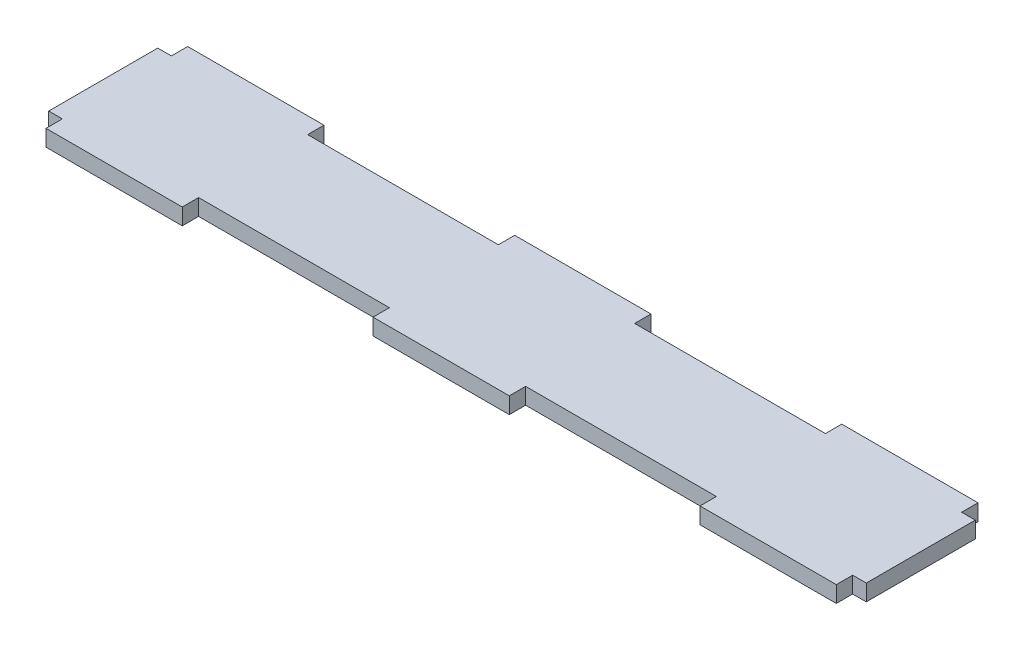
ISO-10303-21;
HEADER;
FILE_DESCRIPTION(('STEP AP214'),'2;1');
FILE_NAME('part.step','',(''),(''),'','','');
FILE_SCHEMA(('AUTOMOTIVE_DESIGN { 1 0 10303 214 1 1 1 1 }'));
ENDSEC;
DATA;
#1=APPLICATION_CONTEXT('core data for automotive mechanical design processes');
#2=APPLICATION_PROTOCOL_DEFINITION('international standard','automotive_design',2000,#1);
#3=PRODUCT_CONTEXT('',#1,'mechanical');
#4=PRODUCT('Part','Part','',(#3));
#5=PRODUCT_RELATED_PRODUCT_CATEGORY('part','',(#4));
#6=PRODUCT_DEFINITION_FORMATION('','',#4);
#7=PRODUCT_DEFINITION_CONTEXT('part definition',#1,'design');
#8=PRODUCT_DEFINITION('design','',#6,#7);
#9=PRODUCT_DEFINITION_SHAPE('','',#8);
#10=(LENGTH_UNIT() NAMED_UNIT(*) SI_UNIT(.MILLI.,.METRE.));
#11=(NAMED_UNIT(*) PLANE_ANGLE_UNIT() SI_UNIT($,.RADIAN.));
#12=(NAMED_UNIT(*) SI_UNIT($,.STERADIAN.) SOLID_ANGLE_UNIT());
#13=UNCERTAINTY_MEASURE_WITH_UNIT(LENGTH_MEASURE(1.E-05),#10,'distance_accuracy_value','');
#14=(GEOMETRIC_REPRESENTATION_CONTEXT(3) GLOBAL_UNCERTAINTY_ASSIGNED_CONTEXT((#13)) GLOBAL_UNIT_ASSIGNED_CONTEXT((#10,
#11,#12)) REPRESENTATION_CONTEXT('',''));
#15=CARTESIAN_POINT('',(0.,0.,0.));
#16=DIRECTION('',(0.,0.,1.));
#17=DIRECTION('',(1.,0.,0.));
#18=AXIS2_PLACEMENT_3D('',#15,#16,#17);
#19=CARTESIAN_POINT('',(75.,3.,0.));
#20=DIRECTION('',(1.,0.,0.));
#21=DIRECTION('',(0.,0.,-1.));
#22=AXIS2_PLACEMENT_3D('',#19,#20,#21);
#23=PLANE('',#22);
#24=DIRECTION('',(0.,0.,1.));
#25=VECTOR('',#24,1.);
#26=CARTESIAN_POINT('',(75.,0.,0.));
#27=LINE('',#26,#25);
#28=CARTESIAN_POINT('',(75.,0.,-10.));
#29=VERTEX_POINT('',#28);
#30=CARTESIAN_POINT('',(75.,0.,10.));
#31=VERTEX_POINT('',#30);
#32=EDGE_CURVE('E256',#29,#31,#27,.T.);
#33=ORIENTED_EDGE('',*,*,#32,.F.);
#34=DIRECTION('',(0.,-1.,0.));
#35=VECTOR('',#34,1.);
#36=CARTESIAN_POINT('',(75.,3.,-10.));
#37=LINE('',#36,#35);
#38=CARTESIAN_POINT('',(75.,3.,-10.));
#39=VERTEX_POINT('',#38);
#40=EDGE_CURVE('E11',#39,#29,#37,.T.);
#41=ORIENTED_EDGE('',*,*,#40,.F.);
#42=DIRECTION('',(0.,0.,1.));
#43=VECTOR('',#42,1.);
#44=CARTESIAN_POINT('',(75.,3.,0.));
#45=LINE('',#44,#43);
#46=CARTESIAN_POINT('',(75.,3.,10.));
#47=VERTEX_POINT('',#46);
#48=EDGE_CURVE('E387',#39,#47,#45,.T.);
#49=ORIENTED_EDGE('',*,*,#48,.T.);
#50=DIRECTION('',(0.,-1.,0.));
#51=VECTOR('',#50,1.);
#52=CARTESIAN_POINT('',(75.,3.,10.));
#53=LINE('',#52,#51);
#54=EDGE_CURVE('E151',#47,#31,#53,.T.);
#55=ORIENTED_EDGE('',*,*,#54,.T.);
#56=EDGE_LOOP('',(#33,#41,#49,#55));
#57=FACE_BOUND('',#56,.T.);
#58=ADVANCED_FACE('F41',(#57),#23,.T.);
#59=CARTESIAN_POINT('',(0.,3.,-10.));
#60=DIRECTION('',(0.,0.,-1.));
#61=DIRECTION('',(-1.,0.,0.));
#62=AXIS2_PLACEMENT_3D('',#59,#60,#61);
#63=PLANE('',#62);
#64=DIRECTION('',(1.,0.,0.));
#65=VECTOR('',#64,1.);
#66=CARTESIAN_POINT('',(0.,0.,-10.));
#67=LINE('',#66,#65);
#68=CARTESIAN_POINT('',(72.5,0.,-10.));
#69=VERTEX_POINT('',#68);
#70=EDGE_CURVE('E259',#69,#29,#67,.T.);
#71=ORIENTED_EDGE('',*,*,#70,.F.);
#72=DIRECTION('',(0.,-1.,0.));
#73=VECTOR('',#72,1.);
#74=CARTESIAN_POINT('',(72.5,3.,-10.));
#75=LINE('',#74,#73);
#76=CARTESIAN_POINT('',(72.5,3.,-10.));
#77=VERTEX_POINT('',#76);
#78=EDGE_CURVE('E49',#77,#69,#75,.T.);
#79=ORIENTED_EDGE('',*,*,#78,.F.);
#80=DIRECTION('',(1.,0.,0.));
#81=VECTOR('',#80,1.);
#82=CARTESIAN_POINT('',(0.,3.,-10.));
#83=LINE('',#82,#81);
#84=EDGE_CURVE('E386',#77,#39,#83,.T.);
#85=ORIENTED_EDGE('',*,*,#84,.T.);
#86=ORIENTED_EDGE('',*,*,#40,.T.);
#87=EDGE_LOOP('',(#71,#79,#85,#86));
#88=FACE_BOUND('',#87,.T.);
#89=ADVANCED_FACE('F385',(#88),#63,.T.);
#90=CARTESIAN_POINT('',(72.5,3.,0.));
#91=DIRECTION('',(-1.,0.,0.));
#92=DIRECTION('',(0.,0.,1.));
#93=AXIS2_PLACEMENT_3D('',#90,#91,#92);
#94=PLANE('',#93);
#95=DIRECTION('',(0.,0.,-1.));
#96=VECTOR('',#95,1.);
#97=CARTESIAN_POINT('',(72.5,0.,0.));
#98=LINE('',#97,#96);
#99=CARTESIAN_POINT('',(72.5,0.,-13.));
#100=VERTEX_POINT('',#99);
#101=EDGE_CURVE('E262',#69,#100,#98,.T.);
#102=ORIENTED_EDGE('',*,*,#101,.T.);
#103=DIRECTION('',(0.,-1.,0.));
#104=VECTOR('',#103,1.);
#105=CARTESIAN_POINT('',(72.5,3.,-13.));
#106=LINE('',#105,#104);
#107=CARTESIAN_POINT('',(72.5,3.,-13.));
#108=VERTEX_POINT('',#107);
#109=EDGE_CURVE('E371',#108,#100,#106,.T.);
#110=ORIENTED_EDGE('',*,*,#109,.F.);
#111=DIRECTION('',(0.,0.,-1.));
#112=VECTOR('',#111,1.);
#113=CARTESIAN_POINT('',(72.5,3.,0.));
#114=LINE('',#113,#112);
#115=EDGE_CURVE('E377',#77,#108,#114,.T.);
#116=ORIENTED_EDGE('',*,*,#115,.F.);
#117=ORIENTED_EDGE('',*,*,#78,.T.);
#118=EDGE_LOOP('',(#102,#110,#116,#117));
#119=FACE_BOUND('',#118,.T.);
#120=ADVANCED_FACE('F375',(#119),#94,.F.);
#121=CARTESIAN_POINT('',(0.,3.,-13.));
#122=DIRECTION('',(0.,0.,-1.));
#123=DIRECTION('',(-1.,0.,0.));
#124=AXIS2_PLACEMENT_3D('',#121,#122,#123);
#125=PLANE('',#124);
#126=DIRECTION('',(1.,0.,0.));
#127=VECTOR('',#126,1.);
#128=CARTESIAN_POINT('',(0.,0.,-13.));
#129=LINE('',#128,#127);
#130=CARTESIAN_POINT('',(47.5,0.,-13.));
#131=VERTEX_POINT('',#130);
#132=EDGE_CURVE('E267',#131,#100,#129,.T.);
#133=ORIENTED_EDGE('',*,*,#132,.F.);
#134=DIRECTION('',(0.,-1.,0.));
#135=VECTOR('',#134,1.);
#136=CARTESIAN_POINT('',(47.5,3.,-13.));
#137=LINE('',#136,#135);
#138=CARTESIAN_POINT('',(47.5,3.,-13.));
#139=VERTEX_POINT('',#138);
#140=EDGE_CURVE('E369',#139,#131,#137,.T.);
#141=ORIENTED_EDGE('',*,*,#140,.F.);
#142=DIRECTION('',(1.,0.,0.));
#143=VECTOR('',#142,1.);
#144=CARTESIAN_POINT('',(0.,3.,-13.));
#145=LINE('',#144,#143);
#146=EDGE_CURVE('E457',#139,#108,#145,.T.);
#147=ORIENTED_EDGE('',*,*,#146,.T.);
#148=ORIENTED_EDGE('',*,*,#109,.T.);
#149=EDGE_LOOP('',(#133,#141,#147,#148));
#150=FACE_BOUND('',#149,.T.);
#151=ADVANCED_FACE('F513',(#150),#125,.T.);
#152=CARTESIAN_POINT('',(47.5,3.,0.));
#153=DIRECTION('',(-1.,0.,0.));
#154=DIRECTION('',(0.,0.,1.));
#155=AXIS2_PLACEMENT_3D('',#152,#153,#154);
#156=PLANE('',#155);
#157=DIRECTION('',(0.,0.,-1.));
#158=VECTOR('',#157,1.);
#159=CARTESIAN_POINT('',(47.5,0.,0.));
#160=LINE('',#159,#158);
#161=CARTESIAN_POINT('',(47.5,0.,-10.));
#162=VERTEX_POINT('',#161);
#163=EDGE_CURVE('E270',#162,#131,#160,.T.);
#164=ORIENTED_EDGE('',*,*,#163,.F.);
#165=DIRECTION('',(0.,-1.,0.));
#166=VECTOR('',#165,1.);
#167=CARTESIAN_POINT('',(47.5,3.,-10.));
#168=LINE('',#167,#166);
#169=CARTESIAN_POINT('',(47.5,3.,-10.));
#170=VERTEX_POINT('',#169);
#171=EDGE_CURVE('E367',#170,#162,#168,.T.);
#172=ORIENTED_EDGE('',*,*,#171,.F.);
#173=DIRECTION('',(0.,0.,-1.));
#174=VECTOR('',#173,1.);
#175=CARTESIAN_POINT('',(47.5,3.,0.));
#176=LINE('',#175,#174);
#177=EDGE_CURVE('E454',#170,#139,#176,.T.);
#178=ORIENTED_EDGE('',*,*,#177,.T.);
#179=ORIENTED_EDGE('',*,*,#140,.T.);
#180=EDGE_LOOP('',(#164,#172,#178,#179));
#181=FACE_BOUND('',#180,.T.);
#182=ADVANCED_FACE('F518',(#181),#156,.T.);
#183=CARTESIAN_POINT('',(12.5,0.,-10.));
#184=VERTEX_POINT('',#183);
#185=EDGE_CURVE('E264',#184,#162,#67,.T.);
#186=ORIENTED_EDGE('',*,*,#185,.F.);
#187=DIRECTION('',(0.,-1.,0.));
#188=VECTOR('',#187,1.);
#189=CARTESIAN_POINT('',(12.5,3.,-10.));
#190=LINE('',#189,#188);
#191=CARTESIAN_POINT('',(12.5,3.,-10.));
#192=VERTEX_POINT('',#191);
#193=EDGE_CURVE('E365',#192,#184,#190,.T.);
#194=ORIENTED_EDGE('',*,*,#193,.F.);
#195=EDGE_CURVE('E453',#192,#170,#83,.T.);
#196=ORIENTED_EDGE('',*,*,#195,.T.);
#197=ORIENTED_EDGE('',*,*,#171,.T.);
#198=EDGE_LOOP('',(#186,#194,#196,#197));
#199=FACE_BOUND('',#198,.T.);
#200=ADVANCED_FACE('F504',(#199),#63,.T.);
#201=CARTESIAN_POINT('',(12.5,3.,0.));
#202=DIRECTION('',(-1.,0.,0.));
#203=DIRECTION('',(0.,0.,1.));
#204=AXIS2_PLACEMENT_3D('',#201,#202,#203);
#205=PLANE('',#204);
#206=DIRECTION('',(0.,0.,-1.));
#207=VECTOR('',#206,1.);
#208=CARTESIAN_POINT('',(12.5,0.,0.));
#209=LINE('',#208,#207);
#210=CARTESIAN_POINT('',(12.5,0.,-13.));
#211=VERTEX_POINT('',#210);
#212=EDGE_CURVE('E273',#184,#211,#209,.T.);
#213=ORIENTED_EDGE('',*,*,#212,.T.);
#214=DIRECTION('',(0.,-1.,0.));
#215=VECTOR('',#214,1.);
#216=CARTESIAN_POINT('',(12.5,3.,-13.));
#217=LINE('',#216,#215);
#218=CARTESIAN_POINT('',(12.5,3.,-13.));
#219=VERTEX_POINT('',#218);
#220=EDGE_CURVE('E363',#219,#211,#217,.T.);
#221=ORIENTED_EDGE('',*,*,#220,.F.);
#222=DIRECTION('',(0.,0.,-1.));
#223=VECTOR('',#222,1.);
#224=CARTESIAN_POINT('',(12.5,3.,0.));
#225=LINE('',#224,#223);
#226=EDGE_CURVE('E451',#192,#219,#225,.T.);
#227=ORIENTED_EDGE('',*,*,#226,.F.);
#228=ORIENTED_EDGE('',*,*,#193,.T.);
#229=EDGE_LOOP('',(#213,#221,#227,#228));
#230=FACE_BOUND('',#229,.T.);
#231=ADVANCED_FACE('F517',(#230),#205,.F.);
#232=CARTESIAN_POINT('',(0.,3.,-13.));
#233=DIRECTION('',(0.,0.,-1.));
#234=DIRECTION('',(-1.,0.,0.));
#235=AXIS2_PLACEMENT_3D('',#232,#233,#234);
#236=PLANE('',#235);
#237=DIRECTION('',(1.,0.,0.));
#238=VECTOR('',#237,1.);
#239=CARTESIAN_POINT('',(0.,0.,-13.));
#240=LINE('',#239,#238);
#241=CARTESIAN_POINT('',(-12.5,0.,-13.));
#242=VERTEX_POINT('',#241);
#243=EDGE_CURVE('E276',#242,#211,#240,.T.);
#244=ORIENTED_EDGE('',*,*,#243,.F.);
#245=DIRECTION('',(0.,-1.,0.));
#246=VECTOR('',#245,1.);
#247=CARTESIAN_POINT('',(-12.5,3.,-13.));
#248=LINE('',#247,#246);
#249=CARTESIAN_POINT('',(-12.5,3.,-13.));
#250=VERTEX_POINT('',#249);
#251=EDGE_CURVE('E361',#250,#242,#248,.T.);
#252=ORIENTED_EDGE('',*,*,#251,.F.);
#253=DIRECTION('',(1.,0.,0.));
#254=VECTOR('',#253,1.);
#255=CARTESIAN_POINT('',(0.,3.,-13.));
#256=LINE('',#255,#254);
#257=EDGE_CURVE('E448',#250,#219,#256,.T.);
#258=ORIENTED_EDGE('',*,*,#257,.T.);
#259=ORIENTED_EDGE('',*,*,#220,.T.);
#260=EDGE_LOOP('',(#244,#252,#258,#259));
#261=FACE_BOUND('',#260,.T.);
#262=ADVANCED_FACE('F555',(#261),#236,.T.);
#263=CARTESIAN_POINT('',(-12.5,3.,0.));
#264=DIRECTION('',(-1.,0.,0.));
#265=DIRECTION('',(0.,0.,1.));
#266=AXIS2_PLACEMENT_3D('',#263,#264,#265);
#267=PLANE('',#266);
#268=DIRECTION('',(0.,0.,-1.));
#269=VECTOR('',#268,1.);
#270=CARTESIAN_POINT('',(-12.5,0.,0.));
#271=LINE('',#270,#269);
#272=CARTESIAN_POINT('',(-12.5,0.,-10.));
#273=VERTEX_POINT('',#272);
#274=EDGE_CURVE('E279',#273,#242,#271,.T.);
#275=ORIENTED_EDGE('',*,*,#274,.F.);
#276=DIRECTION('',(0.,-1.,0.));
#277=VECTOR('',#276,1.);
#278=CARTESIAN_POINT('',(-12.5,3.,-10.));
#279=LINE('',#278,#277);
#280=CARTESIAN_POINT('',(-12.5,3.,-10.));
#281=VERTEX_POINT('',#280);
#282=EDGE_CURVE('E359',#281,#273,#279,.T.);
#283=ORIENTED_EDGE('',*,*,#282,.F.);
#284=DIRECTION('',(0.,0.,-1.));
#285=VECTOR('',#284,1.);
#286=CARTESIAN_POINT('',(-12.5,3.,0.));
#287=LINE('',#286,#285);
#288=EDGE_CURVE('E445',#281,#250,#287,.T.);
#289=ORIENTED_EDGE('',*,*,#288,.T.);
#290=ORIENTED_EDGE('',*,*,#251,.T.);
#291=EDGE_LOOP('',(#275,#283,#289,#290));
#292=FACE_BOUND('',#291,.T.);
#293=ADVANCED_FACE('F474',(#292),#267,.T.);
#294=CARTESIAN_POINT('',(-47.5,0.,-10.));
#295=VERTEX_POINT('',#294);
#296=EDGE_CURVE('E282',#295,#273,#67,.T.);
#297=ORIENTED_EDGE('',*,*,#296,.F.);
#298=DIRECTION('',(0.,-1.,0.));
#299=VECTOR('',#298,1.);
#300=CARTESIAN_POINT('',(-47.5,3.,-10.));
#301=LINE('',#300,#299);
#302=CARTESIAN_POINT('',(-47.5,3.,-10.));
#303=VERTEX_POINT('',#302);
#304=EDGE_CURVE('E357',#303,#295,#301,.T.);
#305=ORIENTED_EDGE('',*,*,#304,.F.);
#306=EDGE_CURVE('E437',#303,#281,#83,.T.);
#307=ORIENTED_EDGE('',*,*,#306,.T.);
#308=ORIENTED_EDGE('',*,*,#282,.T.);
#309=EDGE_LOOP('',(#297,#305,#307,#308));
#310=FACE_BOUND('',#309,.T.);
#311=ADVANCED_FACE('F467',(#310),#63,.T.);
#312=CARTESIAN_POINT('',(-47.5,3.,0.));
#313=DIRECTION('',(-1.,0.,0.));
#314=DIRECTION('',(0.,0.,1.));
#315=AXIS2_PLACEMENT_3D('',#312,#313,#314);
#316=PLANE('',#315);
#317=DIRECTION('',(0.,0.,-1.));
#318=VECTOR('',#317,1.);
#319=CARTESIAN_POINT('',(-47.5,0.,0.));
#320=LINE('',#319,#318);
#321=CARTESIAN_POINT('',(-47.5,0.,-13.));
#322=VERTEX_POINT('',#321);
#323=EDGE_CURVE('E283',#295,#322,#320,.T.);
#324=ORIENTED_EDGE('',*,*,#323,.T.);
#325=DIRECTION('',(0.,-1.,0.));
#326=VECTOR('',#325,1.);
#327=CARTESIAN_POINT('',(-47.5,3.,-13.));
#328=LINE('',#327,#326);
#329=CARTESIAN_POINT('',(-47.5,3.,-13.));
#330=VERTEX_POINT('',#329);
#331=EDGE_CURVE('E354',#330,#322,#328,.T.);
#332=ORIENTED_EDGE('',*,*,#331,.F.);
#333=DIRECTION('',(0.,0.,-1.));
#334=VECTOR('',#333,1.);
#335=CARTESIAN_POINT('',(-47.5,3.,0.));
#336=LINE('',#335,#334);
#337=EDGE_CURVE('E443',#303,#330,#336,.T.);
#338=ORIENTED_EDGE('',*,*,#337,.F.);
#339=ORIENTED_EDGE('',*,*,#304,.T.);
#340=EDGE_LOOP('',(#324,#332,#338,#339));
#341=FACE_BOUND('',#340,.T.);
#342=ADVANCED_FACE('F495',(#341),#316,.F.);
#343=CARTESIAN_POINT('',(0.,3.,-13.));
#344=DIRECTION('',(0.,0.,1.));
#345=DIRECTION('',(1.,0.,0.));
#346=AXIS2_PLACEMENT_3D('',#343,#344,#345);
#347=PLANE('',#346);
#348=DIRECTION('',(-1.,0.,0.));
#349=VECTOR('',#348,1.);
#350=CARTESIAN_POINT('',(0.,0.,-13.));
#351=LINE('',#350,#349);
#352=CARTESIAN_POINT('',(-72.5,0.,-13.));
#353=VERTEX_POINT('',#352);
#354=EDGE_CURVE('E285',#322,#353,#351,.T.);
#355=ORIENTED_EDGE('',*,*,#354,.T.);
#356=DIRECTION('',(0.,-1.,0.));
#357=VECTOR('',#356,1.);
#358=CARTESIAN_POINT('',(-72.5,3.,-13.));
#359=LINE('',#358,#357);
#360=CARTESIAN_POINT('',(-72.5,3.,-13.));
#361=VERTEX_POINT('',#360);
#362=EDGE_CURVE('E352',#361,#353,#359,.T.);
#363=ORIENTED_EDGE('',*,*,#362,.F.);
#364=DIRECTION('',(-1.,0.,0.));
#365=VECTOR('',#364,1.);
#366=CARTESIAN_POINT('',(0.,3.,-13.));
#367=LINE('',#366,#365);
#368=EDGE_CURVE('E441',#330,#361,#367,.T.);
#369=ORIENTED_EDGE('',*,*,#368,.F.);
#370=ORIENTED_EDGE('',*,*,#331,.T.);
#371=EDGE_LOOP('',(#355,#363,#369,#370));
#372=FACE_BOUND('',#371,.T.);
#373=ADVANCED_FACE('F493',(#372),#347,.F.);
#374=CARTESIAN_POINT('',(-72.5,3.,0.));
#375=DIRECTION('',(-1.,0.,0.));
#376=DIRECTION('',(0.,0.,1.));
#377=AXIS2_PLACEMENT_3D('',#374,#375,#376);
#378=PLANE('',#377);
#379=DIRECTION('',(0.,0.,-1.));
#380=VECTOR('',#379,1.);
#381=CARTESIAN_POINT('',(-72.5,0.,0.));
#382=LINE('',#381,#380);
#383=CARTESIAN_POINT('',(-72.5,0.,-10.));
#384=VERTEX_POINT('',#383);
#385=EDGE_CURVE('E288',#384,#353,#382,.T.);
#386=ORIENTED_EDGE('',*,*,#385,.F.);
#387=DIRECTION('',(0.,-1.,0.));
#388=VECTOR('',#387,1.);
#389=CARTESIAN_POINT('',(-72.5,3.,-10.));
#390=LINE('',#389,#388);
#391=CARTESIAN_POINT('',(-72.5,3.,-10.));
#392=VERTEX_POINT('',#391);
#393=EDGE_CURVE('E350',#392,#384,#390,.T.);
#394=ORIENTED_EDGE('',*,*,#393,.F.);
#395=DIRECTION('',(0.,0.,-1.));
#396=VECTOR('',#395,1.);
#397=CARTESIAN_POINT('',(-72.5,3.,0.));
#398=LINE('',#397,#396);
#399=EDGE_CURVE('E435',#392,#361,#398,.T.);
#400=ORIENTED_EDGE('',*,*,#399,.T.);
#401=ORIENTED_EDGE('',*,*,#362,.T.);
#402=EDGE_LOOP('',(#386,#394,#400,#401));
#403=FACE_BOUND('',#402,.T.);
#404=ADVANCED_FACE('F489',(#403),#378,.T.);
#405=CARTESIAN_POINT('',(-75.,0.,-10.));
#406=VERTEX_POINT('',#405);
#407=EDGE_CURVE('E263',#406,#384,#67,.T.);
#408=ORIENTED_EDGE('',*,*,#407,.F.);
#409=DIRECTION('',(0.,-1.,0.));
#410=VECTOR('',#409,1.);
#411=CARTESIAN_POINT('',(-75.,3.,-10.));
#412=LINE('',#411,#410);
#413=CARTESIAN_POINT('',(-75.,3.,-10.));
#414=VERTEX_POINT('',#413);
#415=EDGE_CURVE('E348',#414,#406,#412,.T.);
#416=ORIENTED_EDGE('',*,*,#415,.F.);
#417=EDGE_CURVE('E430',#414,#392,#83,.T.);
#418=ORIENTED_EDGE('',*,*,#417,.T.);
#419=ORIENTED_EDGE('',*,*,#393,.T.);
#420=EDGE_LOOP('',(#408,#416,#418,#419));
#421=FACE_BOUND('',#420,.T.);
#422=ADVANCED_FACE('F486',(#421),#63,.T.);
#423=CARTESIAN_POINT('',(-75.,3.,0.));
#424=DIRECTION('',(1.,0.,0.));
#425=DIRECTION('',(0.,0.,-1.));
#426=AXIS2_PLACEMENT_3D('',#423,#424,#425);
#427=PLANE('',#426);
#428=DIRECTION('',(0.,0.,1.));
#429=VECTOR('',#428,1.);
#430=CARTESIAN_POINT('',(-75.,0.,0.));
#431=LINE('',#430,#429);
#432=CARTESIAN_POINT('',(-75.,0.,10.));
#433=VERTEX_POINT('',#432);
#434=EDGE_CURVE('E291',#406,#433,#431,.T.);
#435=ORIENTED_EDGE('',*,*,#434,.T.);
#436=DIRECTION('',(0.,-1.,0.));
#437=VECTOR('',#436,1.);
#438=CARTESIAN_POINT('',(-75.,3.,10.));
#439=LINE('',#438,#437);
#440=CARTESIAN_POINT('',(-75.,3.,10.));
#441=VERTEX_POINT('',#440);
#442=EDGE_CURVE('E345',#441,#433,#439,.T.);
#443=ORIENTED_EDGE('',*,*,#442,.F.);
#444=DIRECTION('',(0.,0.,1.));
#445=VECTOR('',#444,1.);
#446=CARTESIAN_POINT('',(-75.,3.,0.));
#447=LINE('',#446,#445);
#448=EDGE_CURVE('E427',#414,#441,#447,.T.);
#449=ORIENTED_EDGE('',*,*,#448,.F.);
#450=ORIENTED_EDGE('',*,*,#415,.T.);
#451=EDGE_LOOP('',(#435,#443,#449,#450));
#452=FACE_BOUND('',#451,.T.);
#453=ADVANCED_FACE('F520',(#452),#427,.F.);
#454=CARTESIAN_POINT('',(0.,3.,10.));
#455=DIRECTION('',(0.,0.,-1.));
#456=DIRECTION('',(-1.,0.,0.));
#457=AXIS2_PLACEMENT_3D('',#454,#455,#456);
#458=PLANE('',#457);
#459=DIRECTION('',(1.,0.,0.));
#460=VECTOR('',#459,1.);
#461=CARTESIAN_POINT('',(0.,0.,10.));
#462=LINE('',#461,#460);
#463=CARTESIAN_POINT('',(-72.5,0.,10.));
#464=VERTEX_POINT('',#463);
#465=EDGE_CURVE('E293',#433,#464,#462,.T.);
#466=ORIENTED_EDGE('',*,*,#465,.T.);
#467=DIRECTION('',(0.,-1.,0.));
#468=VECTOR('',#467,1.);
#469=CARTESIAN_POINT('',(-72.5,3.,10.));
#470=LINE('',#469,#468);
#471=CARTESIAN_POINT('',(-72.5,3.,10.));
#472=VERTEX_POINT('',#471);
#473=EDGE_CURVE('E342',#472,#464,#470,.T.);
#474=ORIENTED_EDGE('',*,*,#473,.F.);
#475=DIRECTION('',(1.,0.,0.));
#476=VECTOR('',#475,1.);
#477=CARTESIAN_POINT('',(0.,3.,10.));
#478=LINE('',#477,#476);
#479=EDGE_CURVE('E253',#441,#472,#478,.T.);
#480=ORIENTED_EDGE('',*,*,#479,.F.);
#481=ORIENTED_EDGE('',*,*,#442,.T.);
#482=EDGE_LOOP('',(#466,#474,#480,#481));
#483=FACE_BOUND('',#482,.T.);
#484=ADVANCED_FACE('F525',(#483),#458,.F.);
#485=CARTESIAN_POINT('',(-72.5,3.,0.));
#486=DIRECTION('',(1.,0.,0.));
#487=DIRECTION('',(0.,0.,-1.));
#488=AXIS2_PLACEMENT_3D('',#485,#486,#487);
#489=PLANE('',#488);
#490=DIRECTION('',(0.,0.,1.));
#491=VECTOR('',#490,1.);
#492=CARTESIAN_POINT('',(-72.5,0.,0.));
#493=LINE('',#492,#491);
#494=CARTESIAN_POINT('',(-72.5,0.,13.));
#495=VERTEX_POINT('',#494);
#496=EDGE_CURVE('E295',#464,#495,#493,.T.);
#497=ORIENTED_EDGE('',*,*,#496,.T.);
#498=DIRECTION('',(0.,-1.,0.));
#499=VECTOR('',#498,1.);
#500=CARTESIAN_POINT('',(-72.5,3.,13.));
#501=LINE('',#500,#499);
#502=CARTESIAN_POINT('',(-72.5,3.,13.));
#503=VERTEX_POINT('',#502);
#504=EDGE_CURVE('E340',#503,#495,#501,.T.);
#505=ORIENTED_EDGE('',*,*,#504,.F.);
#506=DIRECTION('',(0.,0.,1.));
#507=VECTOR('',#506,1.);
#508=CARTESIAN_POINT('',(-72.5,3.,0.));
#509=LINE('',#508,#507);
#510=EDGE_CURVE('E426',#472,#503,#509,.T.);
#511=ORIENTED_EDGE('',*,*,#510,.F.);
#512=ORIENTED_EDGE('',*,*,#473,.T.);
#513=EDGE_LOOP('',(#497,#505,#511,#512));
#514=FACE_BOUND('',#513,.T.);
#515=ADVANCED_FACE('F676',(#514),#489,.F.);
#516=CARTESIAN_POINT('',(0.,3.,13.));
#517=DIRECTION('',(0.,0.,1.));
#518=DIRECTION('',(1.,0.,0.));
#519=AXIS2_PLACEMENT_3D('',#516,#517,#518);
#520=PLANE('',#519);
#521=DIRECTION('',(-1.,0.,0.));
#522=VECTOR('',#521,1.);
#523=CARTESIAN_POINT('',(0.,0.,13.));
#524=LINE('',#523,#522);
#525=CARTESIAN_POINT('',(-47.5,0.,13.));
#526=VERTEX_POINT('',#525);
#527=EDGE_CURVE('E300',#526,#495,#524,.T.);
#528=ORIENTED_EDGE('',*,*,#527,.F.);
#529=DIRECTION('',(0.,-1.,0.));
#530=VECTOR('',#529,1.);
#531=CARTESIAN_POINT('',(-47.5,3.,13.));
#532=LINE('',#531,#530);
#533=CARTESIAN_POINT('',(-47.5,3.,13.));
#534=VERTEX_POINT('',#533);
#535=EDGE_CURVE('E338',#534,#526,#532,.T.);
#536=ORIENTED_EDGE('',*,*,#535,.F.);
#537=DIRECTION('',(-1.,0.,0.));
#538=VECTOR('',#537,1.);
#539=CARTESIAN_POINT('',(0.,3.,13.));
#540=LINE('',#539,#538);
#541=EDGE_CURVE('E425',#534,#503,#540,.T.);
#542=ORIENTED_EDGE('',*,*,#541,.T.);
#543=ORIENTED_EDGE('',*,*,#504,.T.);
#544=EDGE_LOOP('',(#528,#536,#542,#543));
#545=FACE_BOUND('',#544,.T.);
#546=ADVANCED_FACE('F687',(#545),#520,.T.);
#547=CARTESIAN_POINT('',(-47.5,3.,0.));
#548=DIRECTION('',(1.,0.,0.));
#549=DIRECTION('',(0.,0.,-1.));
#550=AXIS2_PLACEMENT_3D('',#547,#548,#549);
#551=PLANE('',#550);
#552=DIRECTION('',(0.,0.,1.));
#553=VECTOR('',#552,1.);
#554=CARTESIAN_POINT('',(-47.5,0.,0.));
#555=LINE('',#554,#553);
#556=CARTESIAN_POINT('',(-47.5,0.,10.));
#557=VERTEX_POINT('',#556);
#558=EDGE_CURVE('E303',#557,#526,#555,.T.);
#559=ORIENTED_EDGE('',*,*,#558,.F.);
#560=DIRECTION('',(0.,-1.,0.));
#561=VECTOR('',#560,1.);
#562=CARTESIAN_POINT('',(-47.5,3.,10.));
#563=LINE('',#562,#561);
#564=CARTESIAN_POINT('',(-47.5,3.,10.));
#565=VERTEX_POINT('',#564);
#566=EDGE_CURVE('E336',#565,#557,#563,.T.);
#567=ORIENTED_EDGE('',*,*,#566,.F.);
#568=DIRECTION('',(0.,0.,1.));
#569=VECTOR('',#568,1.);
#570=CARTESIAN_POINT('',(-47.5,3.,0.));
#571=LINE('',#570,#569);
#572=EDGE_CURVE('E422',#565,#534,#571,.T.);
#573=ORIENTED_EDGE('',*,*,#572,.T.);
#574=ORIENTED_EDGE('',*,*,#535,.T.);
#575=EDGE_LOOP('',(#559,#567,#573,#574));
#576=FACE_BOUND('',#575,.T.);
#577=ADVANCED_FACE('F698',(#576),#551,.T.);
#578=CARTESIAN_POINT('',(-12.5,0.,10.));
#579=VERTEX_POINT('',#578);
#580=EDGE_CURVE('E297',#557,#579,#462,.T.);
#581=ORIENTED_EDGE('',*,*,#580,.T.);
#582=DIRECTION('',(0.,-1.,0.));
#583=VECTOR('',#582,1.);
#584=CARTESIAN_POINT('',(-12.5,3.,10.));
#585=LINE('',#584,#583);
#586=CARTESIAN_POINT('',(-12.5,3.,10.));
#587=VERTEX_POINT('',#586);
#588=EDGE_CURVE('E333',#587,#579,#585,.T.);
#589=ORIENTED_EDGE('',*,*,#588,.F.);
#590=EDGE_CURVE('E416',#565,#587,#478,.T.);
#591=ORIENTED_EDGE('',*,*,#590,.F.);
#592=ORIENTED_EDGE('',*,*,#566,.T.);
#593=EDGE_LOOP('',(#581,#589,#591,#592));
#594=FACE_BOUND('',#593,.T.);
#595=ADVANCED_FACE('F395',(#594),#458,.F.);
#596=CARTESIAN_POINT('',(-12.5,3.,0.));
#597=DIRECTION('',(1.,0.,0.));
#598=DIRECTION('',(0.,0.,-1.));
#599=AXIS2_PLACEMENT_3D('',#596,#597,#598);
#600=PLANE('',#599);
#601=DIRECTION('',(0.,0.,1.));
#602=VECTOR('',#601,1.);
#603=CARTESIAN_POINT('',(-12.5,0.,0.));
#604=LINE('',#603,#602);
#605=CARTESIAN_POINT('',(-12.5,0.,13.));
#606=VERTEX_POINT('',#605);
#607=EDGE_CURVE('E306',#579,#606,#604,.T.);
#608=ORIENTED_EDGE('',*,*,#607,.T.);
#609=DIRECTION('',(0.,-1.,0.));
#610=VECTOR('',#609,1.);
#611=CARTESIAN_POINT('',(-12.5,3.,13.));
#612=LINE('',#611,#610);
#613=CARTESIAN_POINT('',(-12.5,3.,13.));
#614=VERTEX_POINT('',#613);
#615=EDGE_CURVE('E330',#614,#606,#612,.T.);
#616=ORIENTED_EDGE('',*,*,#615,.F.);
#617=DIRECTION('',(0.,0.,1.));
#618=VECTOR('',#617,1.);
#619=CARTESIAN_POINT('',(-12.5,3.,0.));
#620=LINE('',#619,#618);
#621=EDGE_CURVE('E403',#587,#614,#620,.T.);
#622=ORIENTED_EDGE('',*,*,#621,.F.);
#623=ORIENTED_EDGE('',*,*,#588,.T.);
#624=EDGE_LOOP('',(#608,#616,#622,#623));
#625=FACE_BOUND('',#624,.T.);
#626=ADVANCED_FACE('F401',(#625),#600,.F.);
#627=CARTESIAN_POINT('',(0.,3.,13.));
#628=DIRECTION('',(0.,0.,-1.));
#629=DIRECTION('',(-1.,0.,0.));
#630=AXIS2_PLACEMENT_3D('',#627,#628,#629);
#631=PLANE('',#630);
#632=DIRECTION('',(1.,0.,0.));
#633=VECTOR('',#632,1.);
#634=CARTESIAN_POINT('',(0.,0.,13.));
#635=LINE('',#634,#633);
#636=CARTESIAN_POINT('',(12.5,0.,13.));
#637=VERTEX_POINT('',#636);
#638=EDGE_CURVE('E308',#606,#637,#635,.T.);
#639=ORIENTED_EDGE('',*,*,#638,.T.);
#640=DIRECTION('',(0.,-1.,0.));
#641=VECTOR('',#640,1.);
#642=CARTESIAN_POINT('',(12.5,3.,13.));
#643=LINE('',#642,#641);
#644=CARTESIAN_POINT('',(12.5,3.,13.));
#645=VERTEX_POINT('',#644);
#646=EDGE_CURVE('E328',#645,#637,#643,.T.);
#647=ORIENTED_EDGE('',*,*,#646,.F.);
#648=DIRECTION('',(1.,0.,0.));
#649=VECTOR('',#648,1.);
#650=CARTESIAN_POINT('',(0.,3.,13.));
#651=LINE('',#650,#649);
#652=EDGE_CURVE('E411',#614,#645,#651,.T.);
#653=ORIENTED_EDGE('',*,*,#652,.F.);
#654=ORIENTED_EDGE('',*,*,#615,.T.);
#655=EDGE_LOOP('',(#639,#647,#653,#654));
#656=FACE_BOUND('',#655,.T.);
#657=ADVANCED_FACE('F408',(#656),#631,.F.);
#658=CARTESIAN_POINT('',(12.5,3.,0.));
#659=DIRECTION('',(1.,0.,0.));
#660=DIRECTION('',(0.,0.,-1.));
#661=AXIS2_PLACEMENT_3D('',#658,#659,#660);
#662=PLANE('',#661);
#663=DIRECTION('',(0.,0.,1.));
#664=VECTOR('',#663,1.);
#665=CARTESIAN_POINT('',(12.5,0.,0.));
#666=LINE('',#665,#664);
#667=CARTESIAN_POINT('',(12.5,0.,10.));
#668=VERTEX_POINT('',#667);
#669=EDGE_CURVE('E311',#668,#637,#666,.T.);
#670=ORIENTED_EDGE('',*,*,#669,.F.);
#671=DIRECTION('',(0.,-1.,0.));
#672=VECTOR('',#671,1.);
#673=CARTESIAN_POINT('',(12.5,3.,10.));
#674=LINE('',#673,#672);
#675=CARTESIAN_POINT('',(12.5,3.,10.));
#676=VERTEX_POINT('',#675);
#677=EDGE_CURVE('E326',#676,#668,#674,.T.);
#678=ORIENTED_EDGE('',*,*,#677,.F.);
#679=DIRECTION('',(0.,0.,1.));
#680=VECTOR('',#679,1.);
#681=CARTESIAN_POINT('',(12.5,3.,0.));
#682=LINE('',#681,#680);
#683=EDGE_CURVE('E413',#676,#645,#682,.T.);
#684=ORIENTED_EDGE('',*,*,#683,.T.);
#685=ORIENTED_EDGE('',*,*,#646,.T.);
#686=EDGE_LOOP('',(#670,#678,#684,#685));
#687=FACE_BOUND('',#686,.T.);
#688=ADVANCED_FACE('F734',(#687),#662,.T.);
#689=CARTESIAN_POINT('',(47.5,0.,10.));
#690=VERTEX_POINT('',#689);
#691=EDGE_CURVE('E314',#668,#690,#462,.T.);
#692=ORIENTED_EDGE('',*,*,#691,.T.);
#693=DIRECTION('',(0.,-1.,0.));
#694=VECTOR('',#693,1.);
#695=CARTESIAN_POINT('',(47.5,3.,10.));
#696=LINE('',#695,#694);
#697=CARTESIAN_POINT('',(47.5,3.,10.));
#698=VERTEX_POINT('',#697);
#699=EDGE_CURVE('E323',#698,#690,#696,.T.);
#700=ORIENTED_EDGE('',*,*,#699,.F.);
#701=EDGE_CURVE('E252',#676,#698,#478,.T.);
#702=ORIENTED_EDGE('',*,*,#701,.F.);
#703=ORIENTED_EDGE('',*,*,#677,.T.);
#704=EDGE_LOOP('',(#692,#700,#702,#703));
#705=FACE_BOUND('',#704,.T.);
#706=ADVANCED_FACE('F717',(#705),#458,.F.);
#707=CARTESIAN_POINT('',(47.5,3.,0.));
#708=DIRECTION('',(1.,0.,0.));
#709=DIRECTION('',(0.,0.,-1.));
#710=AXIS2_PLACEMENT_3D('',#707,#708,#709);
#711=PLANE('',#710);
#712=DIRECTION('',(0.,0.,1.));
#713=VECTOR('',#712,1.);
#714=CARTESIAN_POINT('',(47.5,0.,0.));
#715=LINE('',#714,#713);
#716=CARTESIAN_POINT('',(47.5,0.,13.));
#717=VERTEX_POINT('',#716);
#718=EDGE_CURVE('E315',#690,#717,#715,.T.);
#719=ORIENTED_EDGE('',*,*,#718,.T.);
#720=DIRECTION('',(0.,-1.,0.));
#721=VECTOR('',#720,1.);
#722=CARTESIAN_POINT('',(47.5,3.,13.));
#723=LINE('',#722,#721);
#724=CARTESIAN_POINT('',(47.5,3.,13.));
#725=VERTEX_POINT('',#724);
#726=EDGE_CURVE('E247',#725,#717,#723,.T.);
#727=ORIENTED_EDGE('',*,*,#726,.F.);
#728=DIRECTION('',(0.,0.,1.));
#729=VECTOR('',#728,1.);
#730=CARTESIAN_POINT('',(47.5,3.,0.));
#731=LINE('',#730,#729);
#732=EDGE_CURVE('E234',#698,#725,#731,.T.);
#733=ORIENTED_EDGE('',*,*,#732,.F.);
#734=ORIENTED_EDGE('',*,*,#699,.T.);
#735=EDGE_LOOP('',(#719,#727,#733,#734));
#736=FACE_BOUND('',#735,.T.);
#737=ADVANCED_FACE('F752',(#736),#711,.F.);
#738=CARTESIAN_POINT('',(0.,3.,13.));
#739=DIRECTION('',(0.,0.,-1.));
#740=DIRECTION('',(-1.,0.,0.));
#741=AXIS2_PLACEMENT_3D('',#738,#739,#740);
#742=PLANE('',#741);
#743=DIRECTION('',(1.,0.,0.));
#744=VECTOR('',#743,1.);
#745=CARTESIAN_POINT('',(0.,0.,13.));
#746=LINE('',#745,#744);
#747=CARTESIAN_POINT('',(72.5,0.,13.));
#748=VERTEX_POINT('',#747);
#749=EDGE_CURVE('E243',#717,#748,#746,.T.);
#750=ORIENTED_EDGE('',*,*,#749,.T.);
#751=DIRECTION('',(0.,-1.,0.));
#752=VECTOR('',#751,1.);
#753=CARTESIAN_POINT('',(72.5,3.,13.));
#754=LINE('',#753,#752);
#755=CARTESIAN_POINT('',(72.5,3.,13.));
#756=VERTEX_POINT('',#755);
#757=EDGE_CURVE('E240',#756,#748,#754,.T.);
#758=ORIENTED_EDGE('',*,*,#757,.F.);
#759=DIRECTION('',(1.,0.,0.));
#760=VECTOR('',#759,1.);
#761=CARTESIAN_POINT('',(0.,3.,13.));
#762=LINE('',#761,#760);
#763=EDGE_CURVE('E228',#725,#756,#762,.T.);
#764=ORIENTED_EDGE('',*,*,#763,.F.);
#765=ORIENTED_EDGE('',*,*,#726,.T.);
#766=EDGE_LOOP('',(#750,#758,#764,#765));
#767=FACE_BOUND('',#766,.T.);
#768=ADVANCED_FACE('F241',(#767),#742,.F.);
#769=CARTESIAN_POINT('',(72.5,3.,0.));
#770=DIRECTION('',(1.,0.,0.));
#771=DIRECTION('',(0.,0.,-1.));
#772=AXIS2_PLACEMENT_3D('',#769,#770,#771);
#773=PLANE('',#772);
#774=DIRECTION('',(0.,0.,1.));
#775=VECTOR('',#774,1.);
#776=CARTESIAN_POINT('',(72.5,0.,0.));
#777=LINE('',#776,#775);
#778=CARTESIAN_POINT('',(72.5,0.,10.));
#779=VERTEX_POINT('',#778);
#780=EDGE_CURVE('E318',#779,#748,#777,.T.);
#781=ORIENTED_EDGE('',*,*,#780,.F.);
#782=DIRECTION('',(0.,-1.,0.));
#783=VECTOR('',#782,1.);
#784=CARTESIAN_POINT('',(72.5,3.,10.));
#785=LINE('',#784,#783);
#786=CARTESIAN_POINT('',(72.5,3.,10.));
#787=VERTEX_POINT('',#786);
#788=EDGE_CURVE('E144',#787,#779,#785,.T.);
#789=ORIENTED_EDGE('',*,*,#788,.F.);
#790=DIRECTION('',(0.,0.,1.));
#791=VECTOR('',#790,1.);
#792=CARTESIAN_POINT('',(72.5,3.,0.));
#793=LINE('',#792,#791);
#794=EDGE_CURVE('E232',#787,#756,#793,.T.);
#795=ORIENTED_EDGE('',*,*,#794,.T.);
#796=ORIENTED_EDGE('',*,*,#757,.T.);
#797=EDGE_LOOP('',(#781,#789,#795,#796));
#798=FACE_BOUND('',#797,.T.);
#799=ADVANCED_FACE('F249',(#798),#773,.T.);
#800=EDGE_CURVE('E296',#779,#31,#462,.T.);
#801=ORIENTED_EDGE('',*,*,#800,.T.);
#802=ORIENTED_EDGE('',*,*,#54,.F.);
#803=EDGE_CURVE('E57',#787,#47,#478,.T.);
#804=ORIENTED_EDGE('',*,*,#803,.F.);
#805=ORIENTED_EDGE('',*,*,#788,.T.);
#806=EDGE_LOOP('',(#801,#802,#804,#805));
#807=FACE_BOUND('',#806,.T.);
#808=ADVANCED_FACE('F679',(#807),#458,.F.);
#809=CARTESIAN_POINT('',(0.,3.,0.));
#810=DIRECTION('',(0.,1.,0.));
#811=DIRECTION('',(0.,0.,1.));
#812=AXIS2_PLACEMENT_3D('',#809,#810,#811);
#813=PLANE('',#812);
#814=ORIENTED_EDGE('',*,*,#48,.F.);
#815=ORIENTED_EDGE('',*,*,#84,.F.);
#816=ORIENTED_EDGE('',*,*,#115,.T.);
#817=ORIENTED_EDGE('',*,*,#146,.F.);
#818=ORIENTED_EDGE('',*,*,#177,.F.);
#819=ORIENTED_EDGE('',*,*,#195,.F.);
#820=ORIENTED_EDGE('',*,*,#226,.T.);
#821=ORIENTED_EDGE('',*,*,#257,.F.);
#822=ORIENTED_EDGE('',*,*,#288,.F.);
#823=ORIENTED_EDGE('',*,*,#306,.F.);
#824=ORIENTED_EDGE('',*,*,#337,.T.);
#825=ORIENTED_EDGE('',*,*,#368,.T.);
#826=ORIENTED_EDGE('',*,*,#399,.F.);
#827=ORIENTED_EDGE('',*,*,#417,.F.);
#828=ORIENTED_EDGE('',*,*,#448,.T.);
#829=ORIENTED_EDGE('',*,*,#479,.T.);
#830=ORIENTED_EDGE('',*,*,#510,.T.);
#831=ORIENTED_EDGE('',*,*,#541,.F.);
#832=ORIENTED_EDGE('',*,*,#572,.F.);
#833=ORIENTED_EDGE('',*,*,#590,.T.);
#834=ORIENTED_EDGE('',*,*,#621,.T.);
#835=ORIENTED_EDGE('',*,*,#652,.T.);
#836=ORIENTED_EDGE('',*,*,#683,.F.);
#837=ORIENTED_EDGE('',*,*,#701,.T.);
#838=ORIENTED_EDGE('',*,*,#732,.T.);
#839=ORIENTED_EDGE('',*,*,#763,.T.);
#840=ORIENTED_EDGE('',*,*,#794,.F.);
#841=ORIENTED_EDGE('',*,*,#803,.T.);
#842=EDGE_LOOP('',(#814,#815,#816,#817,#818,#819,#820,#821,#822,#823,#824,#825,#826,#827,#828,
#829,#830,#831,#832,#833,#834,#835,#836,#837,#838,#839,#840,#841));
#843=FACE_BOUND('',#842,.T.);
#844=ADVANCED_FACE('F230',(#843),#813,.T.);
#845=CARTESIAN_POINT('',(0.,0.,0.));
#846=DIRECTION('',(0.,1.,0.));
#847=DIRECTION('',(0.,0.,1.));
#848=AXIS2_PLACEMENT_3D('',#845,#846,#847);
#849=PLANE('',#848);
#850=ORIENTED_EDGE('',*,*,#32,.T.);
#851=ORIENTED_EDGE('',*,*,#800,.F.);
#852=ORIENTED_EDGE('',*,*,#780,.T.);
#853=ORIENTED_EDGE('',*,*,#749,.F.);
#854=ORIENTED_EDGE('',*,*,#718,.F.);
#855=ORIENTED_EDGE('',*,*,#691,.F.);
#856=ORIENTED_EDGE('',*,*,#669,.T.);
#857=ORIENTED_EDGE('',*,*,#638,.F.);
#858=ORIENTED_EDGE('',*,*,#607,.F.);
#859=ORIENTED_EDGE('',*,*,#580,.F.);
#860=ORIENTED_EDGE('',*,*,#558,.T.);
#861=ORIENTED_EDGE('',*,*,#527,.T.);
#862=ORIENTED_EDGE('',*,*,#496,.F.);
#863=ORIENTED_EDGE('',*,*,#465,.F.);
#864=ORIENTED_EDGE('',*,*,#434,.F.);
#865=ORIENTED_EDGE('',*,*,#407,.T.);
#866=ORIENTED_EDGE('',*,*,#385,.T.);
#867=ORIENTED_EDGE('',*,*,#354,.F.);
#868=ORIENTED_EDGE('',*,*,#323,.F.);
#869=ORIENTED_EDGE('',*,*,#296,.T.);
#870=ORIENTED_EDGE('',*,*,#274,.T.);
#871=ORIENTED_EDGE('',*,*,#243,.T.);
#872=ORIENTED_EDGE('',*,*,#212,.F.);
#873=ORIENTED_EDGE('',*,*,#185,.T.);
#874=ORIENTED_EDGE('',*,*,#163,.T.);
#875=ORIENTED_EDGE('',*,*,#132,.T.);
#876=ORIENTED_EDGE('',*,*,#101,.F.);
#877=ORIENTED_EDGE('',*,*,#70,.T.);
#878=EDGE_LOOP('',(#850,#851,#852,#853,#854,#855,#856,#857,#858,#859,#860,#861,#862,#863,#864,
#865,#866,#867,#868,#869,#870,#871,#872,#873,#874,#875,#876,#877));
#879=FACE_BOUND('',#878,.T.);
#880=ADVANCED_FACE('F383',(#879),#849,.F.);
#881=CLOSED_SHELL('',(#58,#89,#120,#151,#182,#200,#231,#262,#293,#311,#342,#373,#404,#422,#453,
#484,#515,#546,#577,#595,#626,#657,#688,#706,#737,#768,#799,#808,#844,#880));
#882=MANIFOLD_SOLID_BREP('B2',#881);
#883=ADVANCED_BREP_SHAPE_REPRESENTATION('',(#18,#882),#14);
#884=SHAPE_DEFINITION_REPRESENTATION(#9,#883);
ENDSEC;
END-ISO-10303-21;
